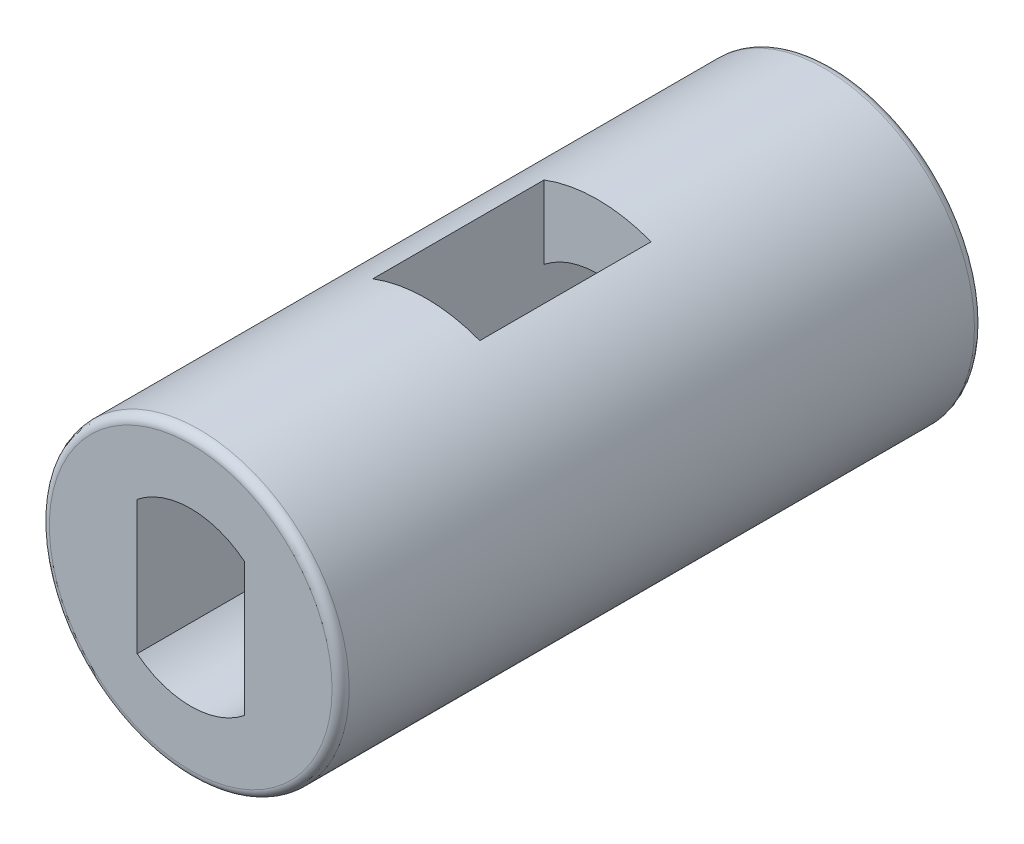
ISO-10303-21;
HEADER;
FILE_DESCRIPTION(('STEP AP214'),'2;1');
FILE_NAME('part.step','',(''),(''),'','','');
FILE_SCHEMA(('AUTOMOTIVE_DESIGN { 1 0 10303 214 1 1 1 1 }'));
ENDSEC;
DATA;
#1=APPLICATION_CONTEXT('core data for automotive mechanical design processes');
#2=APPLICATION_PROTOCOL_DEFINITION('international standard','automotive_design',2000,#1);
#3=PRODUCT_CONTEXT('',#1,'mechanical');
#4=PRODUCT('Part','Part','',(#3));
#5=PRODUCT_RELATED_PRODUCT_CATEGORY('part','',(#4));
#6=PRODUCT_DEFINITION_FORMATION('','',#4);
#7=PRODUCT_DEFINITION_CONTEXT('part definition',#1,'design');
#8=PRODUCT_DEFINITION('design','',#6,#7);
#9=PRODUCT_DEFINITION_SHAPE('','',#8);
#10=(LENGTH_UNIT() NAMED_UNIT(*) SI_UNIT(.MILLI.,.METRE.));
#11=(NAMED_UNIT(*) PLANE_ANGLE_UNIT() SI_UNIT($,.RADIAN.));
#12=(NAMED_UNIT(*) SI_UNIT($,.STERADIAN.) SOLID_ANGLE_UNIT());
#13=UNCERTAINTY_MEASURE_WITH_UNIT(LENGTH_MEASURE(1.E-05),#10,'distance_accuracy_value','');
#14=(GEOMETRIC_REPRESENTATION_CONTEXT(3) GLOBAL_UNCERTAINTY_ASSIGNED_CONTEXT((#13)) GLOBAL_UNIT_ASSIGNED_CONTEXT((#10,
#11,#12)) REPRESENTATION_CONTEXT('',''));
#15=CARTESIAN_POINT('',(0.,0.,0.));
#16=DIRECTION('',(0.,0.,1.));
#17=DIRECTION('',(1.,0.,0.));
#18=AXIS2_PLACEMENT_3D('',#15,#16,#17);
#19=CARTESIAN_POINT('',(0.,0.,7.5));
#20=DIRECTION('',(0.,0.,-1.));
#21=DIRECTION('',(-1.,0.,0.));
#22=AXIS2_PLACEMENT_3D('',#19,#20,#21);
#23=CYLINDRICAL_SURFACE('',#22,2.);
#24=CARTESIAN_POINT('',(0.,0.,-2.));
#25=DIRECTION('',(0.,0.,-1.));
#26=DIRECTION('',(-1.,0.,0.));
#27=AXIS2_PLACEMENT_3D('',#24,#25,#26);
#28=CIRCLE('',#27,2.);
#29=CARTESIAN_POINT('',(-1.25,-1.5612494995996,-2.));
#30=VERTEX_POINT('',#29);
#31=CARTESIAN_POINT('',(1.25,-1.5612494995996,-2.));
#32=VERTEX_POINT('',#31);
#33=EDGE_CURVE('E298',#30,#32,#28,.F.);
#34=ORIENTED_EDGE('',*,*,#33,.T.);
#35=DIRECTION('',(0.,0.,-1.));
#36=VECTOR('',#35,1.);
#37=CARTESIAN_POINT('',(1.25,-1.5612494995996,7.5));
#38=LINE('',#37,#36);
#39=CARTESIAN_POINT('',(1.25,-1.5612494995996,-7.5));
#40=VERTEX_POINT('',#39);
#41=EDGE_CURVE('E146',#32,#40,#38,.T.);
#42=ORIENTED_EDGE('',*,*,#41,.T.);
#43=CARTESIAN_POINT('',(0.,0.,-7.5));
#44=DIRECTION('',(0.,0.,1.));
#45=DIRECTION('',(1.,0.,0.));
#46=AXIS2_PLACEMENT_3D('',#43,#44,#45);
#47=CIRCLE('',#46,2.);
#48=CARTESIAN_POINT('',(-1.25,-1.5612494995996,-7.5));
#49=VERTEX_POINT('',#48);
#50=EDGE_CURVE('E206',#49,#40,#47,.T.);
#51=ORIENTED_EDGE('',*,*,#50,.F.);
#52=DIRECTION('',(0.,0.,-1.));
#53=VECTOR('',#52,1.);
#54=CARTESIAN_POINT('',(-1.25,-1.5612494995996,7.5));
#55=LINE('',#54,#53);
#56=EDGE_CURVE('E226',#30,#49,#55,.T.);
#57=ORIENTED_EDGE('',*,*,#56,.F.);
#58=EDGE_LOOP('',(#34,#42,#51,#57));
#59=FACE_BOUND('',#58,.T.);
#60=ADVANCED_FACE('F34',(#59),#23,.F.);
#61=CARTESIAN_POINT('',(0.,0.,7.5));
#62=DIRECTION('',(0.,0.,-1.));
#63=DIRECTION('',(-1.,0.,0.));
#64=AXIS2_PLACEMENT_3D('',#61,#62,#63);
#65=CYLINDRICAL_SURFACE('',#64,3.5);
#66=CARTESIAN_POINT('',(0.,0.,-7.3));
#67=DIRECTION('',(0.,0.,1.));
#68=DIRECTION('',(1.,0.,0.));
#69=AXIS2_PLACEMENT_3D('',#66,#67,#68);
#70=CIRCLE('',#69,3.5);
#71=CARTESIAN_POINT('',(3.5,0.,-7.3));
#72=VERTEX_POINT('',#71);
#73=EDGE_CURVE('E149',#72,#72,#70,.T.);
#74=ORIENTED_EDGE('',*,*,#73,.T.);
#75=EDGE_LOOP('',(#74));
#76=FACE_BOUND('',#75,.T.);
#77=CARTESIAN_POINT('',(0.,0.,7.3));
#78=DIRECTION('',(0.,0.,1.));
#79=DIRECTION('',(1.,0.,0.));
#80=AXIS2_PLACEMENT_3D('',#77,#78,#79);
#81=CIRCLE('',#80,3.5);
#82=CARTESIAN_POINT('',(3.5,0.,7.3));
#83=VERTEX_POINT('',#82);
#84=EDGE_CURVE('E145',#83,#83,#81,.F.);
#85=ORIENTED_EDGE('',*,*,#84,.T.);
#86=EDGE_LOOP('',(#85));
#87=FACE_BOUND('',#86,.T.);
#88=CARTESIAN_POINT('',(0.,0.,-2.));
#89=DIRECTION('',(0.,0.,-1.));
#90=DIRECTION('',(-1.,0.,0.));
#91=AXIS2_PLACEMENT_3D('',#88,#89,#90);
#92=CIRCLE('',#91,3.5);
#93=CARTESIAN_POINT('',(-1.25,-3.2691742076555,-2.));
#94=VERTEX_POINT('',#93);
#95=CARTESIAN_POINT('',(1.25,-3.2691742076555,-2.));
#96=VERTEX_POINT('',#95);
#97=EDGE_CURVE('E178',#94,#96,#92,.F.);
#98=ORIENTED_EDGE('',*,*,#97,.F.);
#99=DIRECTION('',(0.,0.,-1.));
#100=VECTOR('',#99,1.);
#101=CARTESIAN_POINT('',(-1.25,-3.2691742076555,7.5));
#102=LINE('',#101,#100);
#103=CARTESIAN_POINT('',(-1.25,-3.2691742076555,2.));
#104=VERTEX_POINT('',#103);
#105=EDGE_CURVE('E291',#104,#94,#102,.T.);
#106=ORIENTED_EDGE('',*,*,#105,.F.);
#107=CARTESIAN_POINT('',(0.,0.,2.));
#108=DIRECTION('',(0.,0.,1.));
#109=DIRECTION('',(1.,0.,0.));
#110=AXIS2_PLACEMENT_3D('',#107,#108,#109);
#111=CIRCLE('',#110,3.5);
#112=CARTESIAN_POINT('',(1.25,-3.26917420765551,2.));
#113=VERTEX_POINT('',#112);
#114=EDGE_CURVE('E133',#113,#104,#111,.F.);
#115=ORIENTED_EDGE('',*,*,#114,.F.);
#116=DIRECTION('',(0.,0.,-1.));
#117=VECTOR('',#116,1.);
#118=CARTESIAN_POINT('',(1.25,-3.2691742076555,7.5));
#119=LINE('',#118,#117);
#120=EDGE_CURVE('E49',#96,#113,#119,.F.);
#121=ORIENTED_EDGE('',*,*,#120,.F.);
#122=EDGE_LOOP('',(#98,#106,#115,#121));
#123=FACE_BOUND('',#122,.T.);
#124=DIRECTION('',(0.,0.,-1.));
#125=VECTOR('',#124,1.);
#126=CARTESIAN_POINT('',(-1.25,3.2691742076555,7.5));
#127=LINE('',#126,#125);
#128=CARTESIAN_POINT('',(-1.25,3.2691742076555,2.));
#129=VERTEX_POINT('',#128);
#130=CARTESIAN_POINT('',(-1.25,3.2691742076555,-2.));
#131=VERTEX_POINT('',#130);
#132=EDGE_CURVE('E182',#129,#131,#127,.T.);
#133=ORIENTED_EDGE('',*,*,#132,.T.);
#134=CARTESIAN_POINT('',(0.,0.,-2.));
#135=DIRECTION('',(0.,0.,1.));
#136=DIRECTION('',(1.,0.,0.));
#137=AXIS2_PLACEMENT_3D('',#134,#135,#136);
#138=CIRCLE('',#137,3.5);
#139=CARTESIAN_POINT('',(1.25,3.26917420765551,-2.));
#140=VERTEX_POINT('',#139);
#141=EDGE_CURVE('E184',#131,#140,#138,.F.);
#142=ORIENTED_EDGE('',*,*,#141,.T.);
#143=DIRECTION('',(0.,0.,-1.));
#144=VECTOR('',#143,1.);
#145=CARTESIAN_POINT('',(1.25,3.2691742076555,7.5));
#146=LINE('',#145,#144);
#147=CARTESIAN_POINT('',(1.25,3.2691742076555,2.));
#148=VERTEX_POINT('',#147);
#149=EDGE_CURVE('E193',#140,#148,#146,.F.);
#150=ORIENTED_EDGE('',*,*,#149,.T.);
#151=CARTESIAN_POINT('',(0.,0.,2.));
#152=DIRECTION('',(0.,0.,-1.));
#153=DIRECTION('',(-1.,0.,0.));
#154=AXIS2_PLACEMENT_3D('',#151,#152,#153);
#155=CIRCLE('',#154,3.5);
#156=EDGE_CURVE('E185',#148,#129,#155,.F.);
#157=ORIENTED_EDGE('',*,*,#156,.T.);
#158=EDGE_LOOP('',(#133,#142,#150,#157));
#159=FACE_BOUND('',#158,.T.);
#160=ADVANCED_FACE('F167',(#76,#87,#123,#159),#65,.T.);
#161=CARTESIAN_POINT('',(0.,0.,7.5));
#162=DIRECTION('',(0.,0.,-1.));
#163=DIRECTION('',(-1.,0.,0.));
#164=AXIS2_PLACEMENT_3D('',#161,#162,#163);
#165=CYLINDRICAL_SURFACE('',#164,2.);
#166=DIRECTION('',(0.,0.,-1.));
#167=VECTOR('',#166,1.);
#168=CARTESIAN_POINT('',(-1.25,1.5612494995996,7.5));
#169=LINE('',#168,#167);
#170=CARTESIAN_POINT('',(-1.25,1.5612494995996,7.5));
#171=VERTEX_POINT('',#170);
#172=CARTESIAN_POINT('',(-1.25,1.5612494995996,2.));
#173=VERTEX_POINT('',#172);
#174=EDGE_CURVE('E229',#171,#173,#169,.T.);
#175=ORIENTED_EDGE('',*,*,#174,.T.);
#176=CARTESIAN_POINT('',(0.,0.,2.));
#177=DIRECTION('',(0.,0.,-1.));
#178=DIRECTION('',(-1.,0.,0.));
#179=AXIS2_PLACEMENT_3D('',#176,#177,#178);
#180=CIRCLE('',#179,2.);
#181=CARTESIAN_POINT('',(1.25,1.5612494995996,2.));
#182=VERTEX_POINT('',#181);
#183=EDGE_CURVE('E287',#182,#173,#180,.F.);
#184=ORIENTED_EDGE('',*,*,#183,.F.);
#185=DIRECTION('',(0.,0.,-1.));
#186=VECTOR('',#185,1.);
#187=CARTESIAN_POINT('',(1.25,1.5612494995996,7.5));
#188=LINE('',#187,#186);
#189=CARTESIAN_POINT('',(1.25,1.5612494995996,7.5));
#190=VERTEX_POINT('',#189);
#191=EDGE_CURVE('E151',#190,#182,#188,.T.);
#192=ORIENTED_EDGE('',*,*,#191,.F.);
#193=CARTESIAN_POINT('',(0.,0.,7.5));
#194=DIRECTION('',(0.,0.,1.));
#195=DIRECTION('',(1.,0.,0.));
#196=AXIS2_PLACEMENT_3D('',#193,#194,#195);
#197=CIRCLE('',#196,2.);
#198=EDGE_CURVE('E221',#190,#171,#197,.T.);
#199=ORIENTED_EDGE('',*,*,#198,.T.);
#200=EDGE_LOOP('',(#175,#184,#192,#199));
#201=FACE_BOUND('',#200,.T.);
#202=ADVANCED_FACE('F170',(#201),#165,.F.);
#203=CARTESIAN_POINT('',(1.25,1.5612494995996,-2.));
#204=VERTEX_POINT('',#203);
#205=CARTESIAN_POINT('',(1.25,1.5612494995996,-7.5));
#206=VERTEX_POINT('',#205);
#207=EDGE_CURVE('E231',#204,#206,#188,.T.);
#208=ORIENTED_EDGE('',*,*,#207,.F.);
#209=CARTESIAN_POINT('',(0.,0.,-2.));
#210=DIRECTION('',(0.,0.,1.));
#211=DIRECTION('',(1.,0.,0.));
#212=AXIS2_PLACEMENT_3D('',#209,#210,#211);
#213=CIRCLE('',#212,2.);
#214=CARTESIAN_POINT('',(-1.25,1.5612494995996,-2.));
#215=VERTEX_POINT('',#214);
#216=EDGE_CURVE('E202',#215,#204,#213,.F.);
#217=ORIENTED_EDGE('',*,*,#216,.F.);
#218=CARTESIAN_POINT('',(-1.25,1.5612494995996,-7.5));
#219=VERTEX_POINT('',#218);
#220=EDGE_CURVE('E228',#215,#219,#169,.T.);
#221=ORIENTED_EDGE('',*,*,#220,.T.);
#222=CARTESIAN_POINT('',(0.,0.,-7.5));
#223=DIRECTION('',(0.,0.,1.));
#224=DIRECTION('',(1.,0.,0.));
#225=AXIS2_PLACEMENT_3D('',#222,#223,#224);
#226=CIRCLE('',#225,2.);
#227=EDGE_CURVE('E212',#206,#219,#226,.T.);
#228=ORIENTED_EDGE('',*,*,#227,.F.);
#229=EDGE_LOOP('',(#208,#217,#221,#228));
#230=FACE_BOUND('',#229,.T.);
#231=ADVANCED_FACE('F240',(#230),#165,.F.);
#232=CARTESIAN_POINT('',(0.,0.,7.5));
#233=DIRECTION('',(0.,0.,1.));
#234=DIRECTION('',(1.,0.,0.));
#235=AXIS2_PLACEMENT_3D('',#232,#233,#234);
#236=PLANE('',#235);
#237=CARTESIAN_POINT('',(0.,0.,7.5));
#238=DIRECTION('',(0.,0.,1.));
#239=DIRECTION('',(1.,0.,0.));
#240=AXIS2_PLACEMENT_3D('',#237,#238,#239);
#241=CIRCLE('',#240,3.3);
#242=CARTESIAN_POINT('',(3.3,0.,7.5));
#243=VERTEX_POINT('',#242);
#244=EDGE_CURVE('E11',#243,#243,#241,.T.);
#245=ORIENTED_EDGE('',*,*,#244,.T.);
#246=EDGE_LOOP('',(#245));
#247=FACE_BOUND('',#246,.T.);
#248=DIRECTION('',(0.,1.,0.));
#249=VECTOR('',#248,1.);
#250=CARTESIAN_POINT('',(1.25,1.5612494995996,7.5));
#251=LINE('',#250,#249);
#252=CARTESIAN_POINT('',(1.25,-1.5612494995996,7.5));
#253=VERTEX_POINT('',#252);
#254=EDGE_CURVE('E219',#253,#190,#251,.T.);
#255=ORIENTED_EDGE('',*,*,#254,.F.);
#256=CARTESIAN_POINT('',(0.,0.,7.5));
#257=DIRECTION('',(0.,0.,1.));
#258=DIRECTION('',(1.,0.,0.));
#259=AXIS2_PLACEMENT_3D('',#256,#257,#258);
#260=CIRCLE('',#259,2.);
#261=CARTESIAN_POINT('',(-1.25,-1.5612494995996,7.5));
#262=VERTEX_POINT('',#261);
#263=EDGE_CURVE('E144',#262,#253,#260,.T.);
#264=ORIENTED_EDGE('',*,*,#263,.F.);
#265=DIRECTION('',(0.,-1.,0.));
#266=VECTOR('',#265,1.);
#267=CARTESIAN_POINT('',(-1.25,1.5612494995996,7.5));
#268=LINE('',#267,#266);
#269=EDGE_CURVE('E224',#171,#262,#268,.T.);
#270=ORIENTED_EDGE('',*,*,#269,.F.);
#271=ORIENTED_EDGE('',*,*,#198,.F.);
#272=EDGE_LOOP('',(#255,#264,#270,#271));
#273=FACE_BOUND('',#272,.T.);
#274=ADVANCED_FACE('F272',(#247,#273),#236,.T.);
#275=CARTESIAN_POINT('',(0.,0.,2.));
#276=DIRECTION('',(0.,0.,1.));
#277=DIRECTION('',(1.,0.,0.));
#278=AXIS2_PLACEMENT_3D('',#275,#276,#277);
#279=CIRCLE('',#278,2.);
#280=CARTESIAN_POINT('',(1.25,-1.5612494995996,2.));
#281=VERTEX_POINT('',#280);
#282=CARTESIAN_POINT('',(-1.25,-1.5612494995996,2.));
#283=VERTEX_POINT('',#282);
#284=EDGE_CURVE('E123',#281,#283,#279,.F.);
#285=ORIENTED_EDGE('',*,*,#284,.T.);
#286=EDGE_CURVE('E227',#262,#283,#55,.T.);
#287=ORIENTED_EDGE('',*,*,#286,.F.);
#288=ORIENTED_EDGE('',*,*,#263,.T.);
#289=EDGE_CURVE('E138',#253,#281,#38,.T.);
#290=ORIENTED_EDGE('',*,*,#289,.T.);
#291=EDGE_LOOP('',(#285,#287,#288,#290));
#292=FACE_BOUND('',#291,.T.);
#293=ADVANCED_FACE('F142',(#292),#23,.F.);
#294=CARTESIAN_POINT('',(1.25,1.5612494995996,7.5));
#295=DIRECTION('',(-1.,0.,0.));
#296=DIRECTION('',(0.,-1.,0.));
#297=AXIS2_PLACEMENT_3D('',#294,#295,#296);
#298=PLANE('',#297);
#299=ORIENTED_EDGE('',*,*,#191,.T.);
#300=DIRECTION('',(0.,-1.,0.));
#301=VECTOR('',#300,1.);
#302=CARTESIAN_POINT('',(1.25,3.501,2.));
#303=LINE('',#302,#301);
#304=EDGE_CURVE('E198',#148,#182,#303,.T.);
#305=ORIENTED_EDGE('',*,*,#304,.F.);
#306=ORIENTED_EDGE('',*,*,#149,.F.);
#307=DIRECTION('',(0.,-1.,0.));
#308=VECTOR('',#307,1.);
#309=CARTESIAN_POINT('',(1.25,3.501,-2.));
#310=LINE('',#309,#308);
#311=EDGE_CURVE('E191',#140,#204,#310,.T.);
#312=ORIENTED_EDGE('',*,*,#311,.T.);
#313=ORIENTED_EDGE('',*,*,#207,.T.);
#314=DIRECTION('',(0.,1.,0.));
#315=VECTOR('',#314,1.);
#316=CARTESIAN_POINT('',(1.25,1.5612494995996,-7.5));
#317=LINE('',#316,#315);
#318=EDGE_CURVE('E209',#40,#206,#317,.T.);
#319=ORIENTED_EDGE('',*,*,#318,.F.);
#320=ORIENTED_EDGE('',*,*,#41,.F.);
#321=DIRECTION('',(0.,1.,0.));
#322=VECTOR('',#321,1.);
#323=CARTESIAN_POINT('',(1.25,-3.501,-2.));
#324=LINE('',#323,#322);
#325=EDGE_CURVE('E140',#96,#32,#324,.T.);
#326=ORIENTED_EDGE('',*,*,#325,.F.);
#327=ORIENTED_EDGE('',*,*,#120,.T.);
#328=DIRECTION('',(0.,1.,0.));
#329=VECTOR('',#328,1.);
#330=CARTESIAN_POINT('',(1.25,-3.501,2.));
#331=LINE('',#330,#329);
#332=EDGE_CURVE('E126',#113,#281,#331,.T.);
#333=ORIENTED_EDGE('',*,*,#332,.T.);
#334=ORIENTED_EDGE('',*,*,#289,.F.);
#335=ORIENTED_EDGE('',*,*,#254,.T.);
#336=EDGE_LOOP('',(#299,#305,#306,#312,#313,#319,#320,#326,#327,#333,#334,#335));
#337=FACE_BOUND('',#336,.T.);
#338=ADVANCED_FACE('F137',(#337),#298,.T.);
#339=CARTESIAN_POINT('',(-1.25,1.5612494995996,7.5));
#340=DIRECTION('',(1.,0.,0.));
#341=DIRECTION('',(0.,1.,0.));
#342=AXIS2_PLACEMENT_3D('',#339,#340,#341);
#343=PLANE('',#342);
#344=ORIENTED_EDGE('',*,*,#286,.T.);
#345=DIRECTION('',(0.,1.,0.));
#346=VECTOR('',#345,1.);
#347=CARTESIAN_POINT('',(-1.25,-3.501,2.));
#348=LINE('',#347,#346);
#349=EDGE_CURVE('E128',#104,#283,#348,.T.);
#350=ORIENTED_EDGE('',*,*,#349,.F.);
#351=ORIENTED_EDGE('',*,*,#105,.T.);
#352=DIRECTION('',(0.,1.,0.));
#353=VECTOR('',#352,1.);
#354=CARTESIAN_POINT('',(-1.25,-3.501,-2.));
#355=LINE('',#354,#353);
#356=EDGE_CURVE('E57',#94,#30,#355,.T.);
#357=ORIENTED_EDGE('',*,*,#356,.T.);
#358=ORIENTED_EDGE('',*,*,#56,.T.);
#359=DIRECTION('',(0.,-1.,0.));
#360=VECTOR('',#359,1.);
#361=CARTESIAN_POINT('',(-1.25,1.5612494995996,-7.5));
#362=LINE('',#361,#360);
#363=EDGE_CURVE('E215',#219,#49,#362,.T.);
#364=ORIENTED_EDGE('',*,*,#363,.F.);
#365=ORIENTED_EDGE('',*,*,#220,.F.);
#366=DIRECTION('',(0.,-1.,0.));
#367=VECTOR('',#366,1.);
#368=CARTESIAN_POINT('',(-1.25,3.501,-2.));
#369=LINE('',#368,#367);
#370=EDGE_CURVE('E189',#131,#215,#369,.T.);
#371=ORIENTED_EDGE('',*,*,#370,.F.);
#372=ORIENTED_EDGE('',*,*,#132,.F.);
#373=DIRECTION('',(0.,-1.,0.));
#374=VECTOR('',#373,1.);
#375=CARTESIAN_POINT('',(-1.25,3.501,2.));
#376=LINE('',#375,#374);
#377=EDGE_CURVE('E200',#129,#173,#376,.T.);
#378=ORIENTED_EDGE('',*,*,#377,.T.);
#379=ORIENTED_EDGE('',*,*,#174,.F.);
#380=ORIENTED_EDGE('',*,*,#269,.T.);
#381=EDGE_LOOP('',(#344,#350,#351,#357,#358,#364,#365,#371,#372,#378,#379,#380));
#382=FACE_BOUND('',#381,.T.);
#383=ADVANCED_FACE('F241',(#382),#343,.T.);
#384=CARTESIAN_POINT('',(0.,0.,-7.5));
#385=DIRECTION('',(0.,0.,1.));
#386=DIRECTION('',(1.,0.,0.));
#387=AXIS2_PLACEMENT_3D('',#384,#385,#386);
#388=PLANE('',#387);
#389=CARTESIAN_POINT('',(0.,0.,-7.5));
#390=DIRECTION('',(0.,0.,1.));
#391=DIRECTION('',(1.,0.,0.));
#392=AXIS2_PLACEMENT_3D('',#389,#390,#391);
#393=CIRCLE('',#392,3.3);
#394=CARTESIAN_POINT('',(3.3,0.,-7.5));
#395=VERTEX_POINT('',#394);
#396=EDGE_CURVE('E42',#395,#395,#393,.F.);
#397=ORIENTED_EDGE('',*,*,#396,.T.);
#398=EDGE_LOOP('',(#397));
#399=FACE_BOUND('',#398,.T.);
#400=ORIENTED_EDGE('',*,*,#363,.T.);
#401=ORIENTED_EDGE('',*,*,#50,.T.);
#402=ORIENTED_EDGE('',*,*,#318,.T.);
#403=ORIENTED_EDGE('',*,*,#227,.T.);
#404=EDGE_LOOP('',(#400,#401,#402,#403));
#405=FACE_BOUND('',#404,.T.);
#406=ADVANCED_FACE('F159',(#399,#405),#388,.F.);
#407=CARTESIAN_POINT('',(-1.25,3.501,2.));
#408=DIRECTION('',(0.,0.,-1.));
#409=DIRECTION('',(-1.,0.,0.));
#410=AXIS2_PLACEMENT_3D('',#407,#408,#409);
#411=PLANE('',#410);
#412=ORIENTED_EDGE('',*,*,#304,.T.);
#413=ORIENTED_EDGE('',*,*,#183,.T.);
#414=ORIENTED_EDGE('',*,*,#377,.F.);
#415=ORIENTED_EDGE('',*,*,#156,.F.);
#416=EDGE_LOOP('',(#412,#413,#414,#415));
#417=FACE_BOUND('',#416,.T.);
#418=ADVANCED_FACE('F252',(#417),#411,.T.);
#419=CARTESIAN_POINT('',(-1.25,3.501,-2.));
#420=DIRECTION('',(0.,0.,1.));
#421=DIRECTION('',(1.,0.,0.));
#422=AXIS2_PLACEMENT_3D('',#419,#420,#421);
#423=PLANE('',#422);
#424=ORIENTED_EDGE('',*,*,#370,.T.);
#425=ORIENTED_EDGE('',*,*,#216,.T.);
#426=ORIENTED_EDGE('',*,*,#311,.F.);
#427=ORIENTED_EDGE('',*,*,#141,.F.);
#428=EDGE_LOOP('',(#424,#425,#426,#427));
#429=FACE_BOUND('',#428,.T.);
#430=ADVANCED_FACE('F249',(#429),#423,.T.);
#431=CARTESIAN_POINT('',(-1.25,-3.501,-2.));
#432=DIRECTION('',(0.,0.,-1.));
#433=DIRECTION('',(-1.,0.,0.));
#434=AXIS2_PLACEMENT_3D('',#431,#432,#433);
#435=PLANE('',#434);
#436=ORIENTED_EDGE('',*,*,#97,.T.);
#437=ORIENTED_EDGE('',*,*,#325,.T.);
#438=ORIENTED_EDGE('',*,*,#33,.F.);
#439=ORIENTED_EDGE('',*,*,#356,.F.);
#440=EDGE_LOOP('',(#436,#437,#438,#439));
#441=FACE_BOUND('',#440,.T.);
#442=ADVANCED_FACE('F251',(#441),#435,.F.);
#443=CARTESIAN_POINT('',(-1.25,-3.501,2.));
#444=DIRECTION('',(0.,0.,1.));
#445=DIRECTION('',(1.,0.,0.));
#446=AXIS2_PLACEMENT_3D('',#443,#444,#445);
#447=PLANE('',#446);
#448=ORIENTED_EDGE('',*,*,#114,.T.);
#449=ORIENTED_EDGE('',*,*,#349,.T.);
#450=ORIENTED_EDGE('',*,*,#284,.F.);
#451=ORIENTED_EDGE('',*,*,#332,.F.);
#452=EDGE_LOOP('',(#448,#449,#450,#451));
#453=FACE_BOUND('',#452,.T.);
#454=ADVANCED_FACE('F125',(#453),#447,.F.);
#455=CARTESIAN_POINT('',(0.,0.,-7.3));
#456=DIRECTION('',(0.,0.,1.));
#457=DIRECTION('',(1.,0.,0.));
#458=AXIS2_PLACEMENT_3D('',#455,#456,#457);
#459=TOROIDAL_SURFACE('',#458,3.3,0.2);
#460=ORIENTED_EDGE('',*,*,#396,.F.);
#461=EDGE_LOOP('',(#460));
#462=FACE_BOUND('',#461,.T.);
#463=ORIENTED_EDGE('',*,*,#73,.F.);
#464=EDGE_LOOP('',(#463));
#465=FACE_BOUND('',#464,.T.);
#466=ADVANCED_FACE('F162',(#462,#465),#459,.T.);
#467=CARTESIAN_POINT('',(0.,0.,7.3));
#468=DIRECTION('',(0.,0.,1.));
#469=DIRECTION('',(1.,0.,0.));
#470=AXIS2_PLACEMENT_3D('',#467,#468,#469);
#471=TOROIDAL_SURFACE('',#470,3.3,0.2);
#472=ORIENTED_EDGE('',*,*,#84,.F.);
#473=EDGE_LOOP('',(#472));
#474=FACE_BOUND('',#473,.T.);
#475=ORIENTED_EDGE('',*,*,#244,.F.);
#476=EDGE_LOOP('',(#475));
#477=FACE_BOUND('',#476,.T.);
#478=ADVANCED_FACE('F36',(#474,#477),#471,.T.);
#479=CLOSED_SHELL('',(#60,#160,#202,#231,#274,#293,#338,#383,#406,#418,#430,#442,#454,#466,#478));
#480=MANIFOLD_SOLID_BREP('B2',#479);
#481=ADVANCED_BREP_SHAPE_REPRESENTATION('',(#18,#480),#14);
#482=SHAPE_DEFINITION_REPRESENTATION(#9,#481);
ENDSEC;
END-ISO-10303-21;
